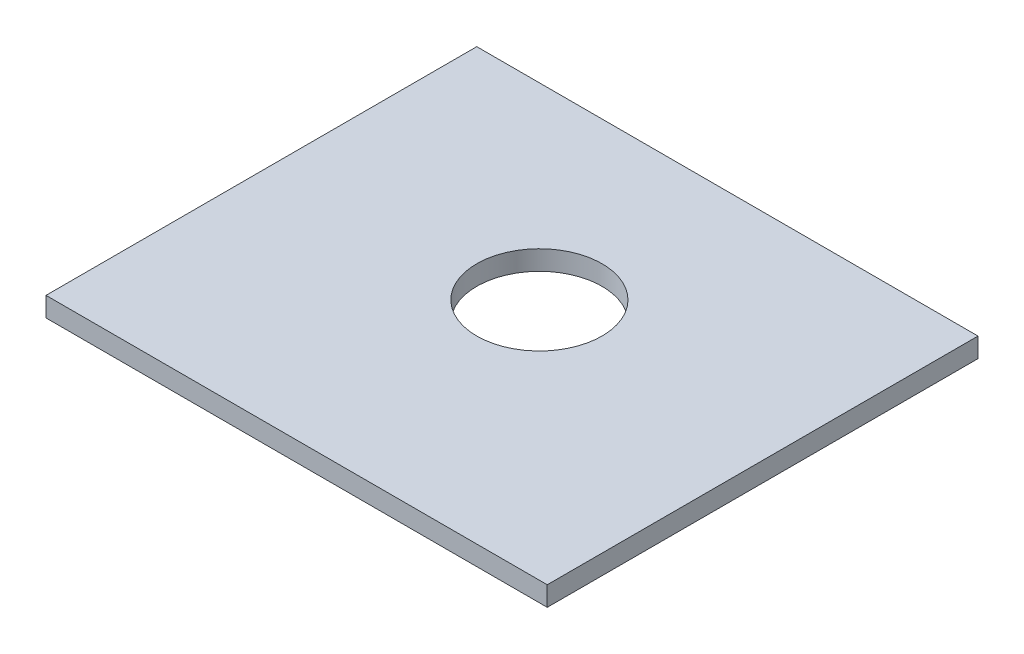
ISO-10303-21;
HEADER;
FILE_DESCRIPTION(('STEP AP214'),'2;1');
FILE_NAME('part.step','',(''),(''),'','','');
FILE_SCHEMA(('AUTOMOTIVE_DESIGN { 1 0 10303 214 1 1 1 1 }'));
ENDSEC;
DATA;
#1=APPLICATION_CONTEXT('core data for automotive mechanical design processes');
#2=APPLICATION_PROTOCOL_DEFINITION('international standard','automotive_design',2000,#1);
#3=PRODUCT_CONTEXT('',#1,'mechanical');
#4=PRODUCT('Part','Part','',(#3));
#5=PRODUCT_RELATED_PRODUCT_CATEGORY('part','',(#4));
#6=PRODUCT_DEFINITION_FORMATION('','',#4);
#7=PRODUCT_DEFINITION_CONTEXT('part definition',#1,'design');
#8=PRODUCT_DEFINITION('design','',#6,#7);
#9=PRODUCT_DEFINITION_SHAPE('','',#8);
#10=(LENGTH_UNIT() NAMED_UNIT(*) SI_UNIT(.MILLI.,.METRE.));
#11=(NAMED_UNIT(*) PLANE_ANGLE_UNIT() SI_UNIT($,.RADIAN.));
#12=(NAMED_UNIT(*) SI_UNIT($,.STERADIAN.) SOLID_ANGLE_UNIT());
#13=UNCERTAINTY_MEASURE_WITH_UNIT(LENGTH_MEASURE(1.E-05),#10,'distance_accuracy_value','');
#14=(GEOMETRIC_REPRESENTATION_CONTEXT(3) GLOBAL_UNCERTAINTY_ASSIGNED_CONTEXT((#13)) GLOBAL_UNIT_ASSIGNED_CONTEXT((#10,
#11,#12)) REPRESENTATION_CONTEXT('',''));
#15=CARTESIAN_POINT('',(0.,0.,0.));
#16=DIRECTION('',(0.,0.,1.));
#17=DIRECTION('',(1.,0.,0.));
#18=AXIS2_PLACEMENT_3D('',#15,#16,#17);
#19=CARTESIAN_POINT('',(-40.64,3.175,34.925));
#20=DIRECTION('',(1.,0.,0.));
#21=DIRECTION('',(0.,0.,-1.));
#22=AXIS2_PLACEMENT_3D('',#19,#20,#21);
#23=PLANE('',#22);
#24=DIRECTION('',(0.,0.,1.));
#25=VECTOR('',#24,1.);
#26=CARTESIAN_POINT('',(-40.64,0.,34.925));
#27=LINE('',#26,#25);
#28=CARTESIAN_POINT('',(-40.64,0.,-34.925));
#29=VERTEX_POINT('',#28);
#30=CARTESIAN_POINT('',(-40.64,0.,34.925));
#31=VERTEX_POINT('',#30);
#32=EDGE_CURVE('E119',#29,#31,#27,.T.);
#33=ORIENTED_EDGE('',*,*,#32,.T.);
#34=DIRECTION('',(0.,-1.,0.));
#35=VECTOR('',#34,1.);
#36=CARTESIAN_POINT('',(-40.64,3.175,34.925));
#37=LINE('',#36,#35);
#38=CARTESIAN_POINT('',(-40.64,3.175,34.925));
#39=VERTEX_POINT('',#38);
#40=EDGE_CURVE('E13',#39,#31,#37,.T.);
#41=ORIENTED_EDGE('',*,*,#40,.F.);
#42=DIRECTION('',(0.,0.,1.));
#43=VECTOR('',#42,1.);
#44=CARTESIAN_POINT('',(-40.64,3.175,34.925));
#45=LINE('',#44,#43);
#46=CARTESIAN_POINT('',(-40.64,3.175,-34.925));
#47=VERTEX_POINT('',#46);
#48=EDGE_CURVE('E103',#47,#39,#45,.T.);
#49=ORIENTED_EDGE('',*,*,#48,.F.);
#50=DIRECTION('',(0.,-1.,0.));
#51=VECTOR('',#50,1.);
#52=CARTESIAN_POINT('',(-40.64,3.175,-34.925));
#53=LINE('',#52,#51);
#54=EDGE_CURVE('E115',#47,#29,#53,.T.);
#55=ORIENTED_EDGE('',*,*,#54,.T.);
#56=EDGE_LOOP('',(#33,#41,#49,#55));
#57=FACE_BOUND('',#56,.T.);
#58=ADVANCED_FACE('F51',(#57),#23,.F.);
#59=CARTESIAN_POINT('',(40.64,3.175,34.925));
#60=DIRECTION('',(0.,0.,-1.));
#61=DIRECTION('',(-1.,0.,0.));
#62=AXIS2_PLACEMENT_3D('',#59,#60,#61);
#63=PLANE('',#62);
#64=DIRECTION('',(1.,0.,0.));
#65=VECTOR('',#64,1.);
#66=CARTESIAN_POINT('',(40.64,0.,34.925));
#67=LINE('',#66,#65);
#68=CARTESIAN_POINT('',(40.64,0.,34.925));
#69=VERTEX_POINT('',#68);
#70=EDGE_CURVE('E108',#31,#69,#67,.T.);
#71=ORIENTED_EDGE('',*,*,#70,.T.);
#72=DIRECTION('',(0.,-1.,0.));
#73=VECTOR('',#72,1.);
#74=CARTESIAN_POINT('',(40.64,3.175,34.925));
#75=LINE('',#74,#73);
#76=CARTESIAN_POINT('',(40.64,3.175,34.925));
#77=VERTEX_POINT('',#76);
#78=EDGE_CURVE('E60',#77,#69,#75,.T.);
#79=ORIENTED_EDGE('',*,*,#78,.F.);
#80=DIRECTION('',(1.,0.,0.));
#81=VECTOR('',#80,1.);
#82=CARTESIAN_POINT('',(40.64,3.175,34.925));
#83=LINE('',#82,#81);
#84=EDGE_CURVE('E98',#39,#77,#83,.T.);
#85=ORIENTED_EDGE('',*,*,#84,.F.);
#86=ORIENTED_EDGE('',*,*,#40,.T.);
#87=EDGE_LOOP('',(#71,#79,#85,#86));
#88=FACE_BOUND('',#87,.T.);
#89=ADVANCED_FACE('F107',(#88),#63,.F.);
#90=CARTESIAN_POINT('',(40.64,3.175,34.925));
#91=DIRECTION('',(-1.,0.,0.));
#92=DIRECTION('',(0.,0.,1.));
#93=AXIS2_PLACEMENT_3D('',#90,#91,#92);
#94=PLANE('',#93);
#95=DIRECTION('',(0.,0.,-1.));
#96=VECTOR('',#95,1.);
#97=CARTESIAN_POINT('',(40.64,0.,34.925));
#98=LINE('',#97,#96);
#99=CARTESIAN_POINT('',(40.64,0.,-34.925));
#100=VERTEX_POINT('',#99);
#101=EDGE_CURVE('E85',#69,#100,#98,.T.);
#102=ORIENTED_EDGE('',*,*,#101,.T.);
#103=DIRECTION('',(0.,-1.,0.));
#104=VECTOR('',#103,1.);
#105=CARTESIAN_POINT('',(40.64,3.175,-34.925));
#106=LINE('',#105,#104);
#107=CARTESIAN_POINT('',(40.64,3.175,-34.925));
#108=VERTEX_POINT('',#107);
#109=EDGE_CURVE('E110',#108,#100,#106,.T.);
#110=ORIENTED_EDGE('',*,*,#109,.F.);
#111=DIRECTION('',(0.,0.,-1.));
#112=VECTOR('',#111,1.);
#113=CARTESIAN_POINT('',(40.64,3.175,34.925));
#114=LINE('',#113,#112);
#115=EDGE_CURVE('E101',#77,#108,#114,.T.);
#116=ORIENTED_EDGE('',*,*,#115,.F.);
#117=ORIENTED_EDGE('',*,*,#78,.T.);
#118=EDGE_LOOP('',(#102,#110,#116,#117));
#119=FACE_BOUND('',#118,.T.);
#120=ADVANCED_FACE('F111',(#119),#94,.F.);
#121=CARTESIAN_POINT('',(40.64,3.175,-34.925));
#122=DIRECTION('',(0.,0.,1.));
#123=DIRECTION('',(1.,0.,0.));
#124=AXIS2_PLACEMENT_3D('',#121,#122,#123);
#125=PLANE('',#124);
#126=DIRECTION('',(-1.,0.,0.));
#127=VECTOR('',#126,1.);
#128=CARTESIAN_POINT('',(40.64,0.,-34.925));
#129=LINE('',#128,#127);
#130=EDGE_CURVE('E91',#100,#29,#129,.T.);
#131=ORIENTED_EDGE('',*,*,#130,.T.);
#132=ORIENTED_EDGE('',*,*,#54,.F.);
#133=DIRECTION('',(-1.,0.,0.));
#134=VECTOR('',#133,1.);
#135=CARTESIAN_POINT('',(40.64,3.175,-34.925));
#136=LINE('',#135,#134);
#137=EDGE_CURVE('E68',#108,#47,#136,.T.);
#138=ORIENTED_EDGE('',*,*,#137,.F.);
#139=ORIENTED_EDGE('',*,*,#109,.T.);
#140=EDGE_LOOP('',(#131,#132,#138,#139));
#141=FACE_BOUND('',#140,.T.);
#142=ADVANCED_FACE('F133',(#141),#125,.F.);
#143=CARTESIAN_POINT('',(0.,3.175,0.));
#144=DIRECTION('',(0.,1.,0.));
#145=DIRECTION('',(0.,0.,1.));
#146=AXIS2_PLACEMENT_3D('',#143,#144,#145);
#147=PLANE('',#146);
#148=CARTESIAN_POINT('',(0.,3.175,-4.44499999999999));
#149=DIRECTION('',(0.,1.,0.));
#150=DIRECTION('',(0.,0.,1.));
#151=AXIS2_PLACEMENT_3D('',#148,#149,#150);
#152=CIRCLE('',#151,10.16);
#153=CARTESIAN_POINT('',(0.,3.175,5.71500000000001));
#154=VERTEX_POINT('',#153);
#155=EDGE_CURVE('E143',#154,#154,#152,.T.);
#156=ORIENTED_EDGE('',*,*,#155,.F.);
#157=EDGE_LOOP('',(#156));
#158=FACE_BOUND('',#157,.T.);
#159=ORIENTED_EDGE('',*,*,#48,.T.);
#160=ORIENTED_EDGE('',*,*,#84,.T.);
#161=ORIENTED_EDGE('',*,*,#115,.T.);
#162=ORIENTED_EDGE('',*,*,#137,.T.);
#163=EDGE_LOOP('',(#159,#160,#161,#162));
#164=FACE_BOUND('',#163,.T.);
#165=ADVANCED_FACE('F99',(#158,#164),#147,.T.);
#166=CARTESIAN_POINT('',(0.,0.,0.));
#167=DIRECTION('',(0.,1.,0.));
#168=DIRECTION('',(0.,0.,1.));
#169=AXIS2_PLACEMENT_3D('',#166,#167,#168);
#170=PLANE('',#169);
#171=CARTESIAN_POINT('',(0.,0.,-4.44499999999999));
#172=DIRECTION('',(0.,1.,0.));
#173=DIRECTION('',(0.,0.,1.));
#174=AXIS2_PLACEMENT_3D('',#171,#172,#173);
#175=CIRCLE('',#174,10.16);
#176=CARTESIAN_POINT('',(0.,0.,5.71500000000001));
#177=VERTEX_POINT('',#176);
#178=EDGE_CURVE('E123',#177,#177,#175,.F.);
#179=ORIENTED_EDGE('',*,*,#178,.F.);
#180=EDGE_LOOP('',(#179));
#181=FACE_BOUND('',#180,.T.);
#182=ORIENTED_EDGE('',*,*,#32,.F.);
#183=ORIENTED_EDGE('',*,*,#130,.F.);
#184=ORIENTED_EDGE('',*,*,#101,.F.);
#185=ORIENTED_EDGE('',*,*,#70,.F.);
#186=EDGE_LOOP('',(#182,#183,#184,#185));
#187=FACE_BOUND('',#186,.T.);
#188=ADVANCED_FACE('F136',(#181,#187),#170,.F.);
#189=CARTESIAN_POINT('',(0.,-0.00100000000000013,-4.44499999999999));
#190=DIRECTION('',(0.,1.,0.));
#191=DIRECTION('',(0.,0.,1.));
#192=AXIS2_PLACEMENT_3D('',#189,#190,#191);
#193=CYLINDRICAL_SURFACE('',#192,10.16);
#194=ORIENTED_EDGE('',*,*,#155,.T.);
#195=EDGE_LOOP('',(#194));
#196=FACE_BOUND('',#195,.T.);
#197=ORIENTED_EDGE('',*,*,#178,.T.);
#198=EDGE_LOOP('',(#197));
#199=FACE_BOUND('',#198,.T.);
#200=ADVANCED_FACE('F148',(#196,#199),#193,.F.);
#201=CLOSED_SHELL('',(#58,#89,#120,#142,#165,#188,#200));
#202=MANIFOLD_SOLID_BREP('B2',#201);
#203=ADVANCED_BREP_SHAPE_REPRESENTATION('',(#18,#202),#14);
#204=SHAPE_DEFINITION_REPRESENTATION(#9,#203);
ENDSEC;
END-ISO-10303-21;
